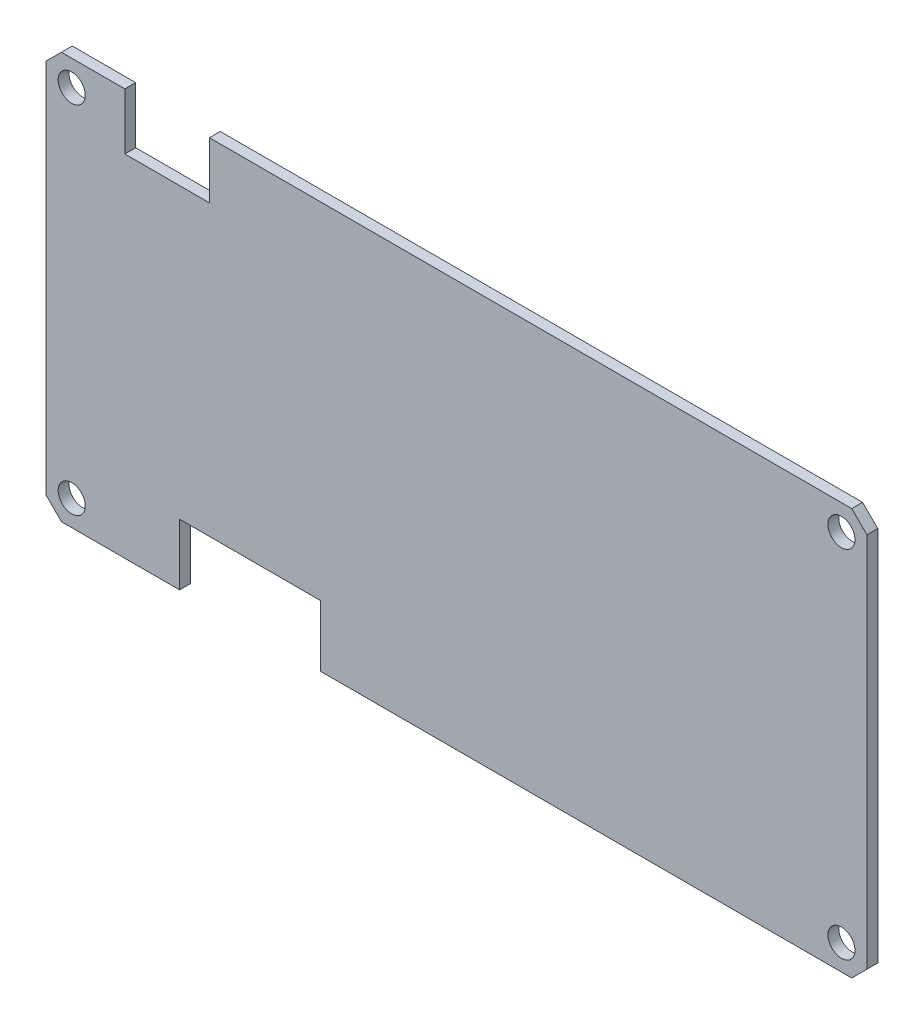
ISO-10303-21;
HEADER;
FILE_DESCRIPTION(('STEP AP214'),'2;1');
FILE_NAME('part.step','',(''),(''),'','','');
FILE_SCHEMA(('AUTOMOTIVE_DESIGN { 1 0 10303 214 1 1 1 1 }'));
ENDSEC;
DATA;
#1=APPLICATION_CONTEXT('core data for automotive mechanical design processes');
#2=APPLICATION_PROTOCOL_DEFINITION('international standard','automotive_design',2000,#1);
#3=PRODUCT_CONTEXT('',#1,'mechanical');
#4=PRODUCT('Part','Part','',(#3));
#5=PRODUCT_RELATED_PRODUCT_CATEGORY('part','',(#4));
#6=PRODUCT_DEFINITION_FORMATION('','',#4);
#7=PRODUCT_DEFINITION_CONTEXT('part definition',#1,'design');
#8=PRODUCT_DEFINITION('design','',#6,#7);
#9=PRODUCT_DEFINITION_SHAPE('','',#8);
#10=(LENGTH_UNIT() NAMED_UNIT(*) SI_UNIT(.MILLI.,.METRE.));
#11=(NAMED_UNIT(*) PLANE_ANGLE_UNIT() SI_UNIT($,.RADIAN.));
#12=(NAMED_UNIT(*) SI_UNIT($,.STERADIAN.) SOLID_ANGLE_UNIT());
#13=UNCERTAINTY_MEASURE_WITH_UNIT(LENGTH_MEASURE(1.E-05),#10,'distance_accuracy_value','');
#14=(GEOMETRIC_REPRESENTATION_CONTEXT(3) GLOBAL_UNCERTAINTY_ASSIGNED_CONTEXT((#13)) GLOBAL_UNIT_ASSIGNED_CONTEXT((#10,
#11,#12)) REPRESENTATION_CONTEXT('',''));
#15=CARTESIAN_POINT('',(0.,0.,0.));
#16=DIRECTION('',(0.,0.,1.));
#17=DIRECTION('',(1.,0.,0.));
#18=AXIS2_PLACEMENT_3D('',#15,#16,#17);
#19=CARTESIAN_POINT('',(0.,18.75,1.));
#20=DIRECTION('',(0.,-1.,0.));
#21=DIRECTION('',(1.,0.,0.));
#22=AXIS2_PLACEMENT_3D('',#19,#20,#21);
#23=PLANE('',#22);
#24=DIRECTION('',(-1.,0.,0.));
#25=VECTOR('',#24,1.);
#26=CARTESIAN_POINT('',(0.,18.75,0.));
#27=LINE('',#26,#25);
#28=CARTESIAN_POINT('',(40.5,18.75,0.));
#29=VERTEX_POINT('',#28);
#30=CARTESIAN_POINT('',(-18.75,18.75,0.));
#31=VERTEX_POINT('',#30);
#32=EDGE_CURVE('E37',#29,#31,#27,.T.);
#33=ORIENTED_EDGE('',*,*,#32,.T.);
#34=DIRECTION('',(0.,0.,-1.));
#35=VECTOR('',#34,1.);
#36=CARTESIAN_POINT('',(-18.75,18.75,1.));
#37=LINE('',#36,#35);
#38=CARTESIAN_POINT('',(-18.75,18.75,1.));
#39=VERTEX_POINT('',#38);
#40=EDGE_CURVE('E176',#39,#31,#37,.T.);
#41=ORIENTED_EDGE('',*,*,#40,.F.);
#42=DIRECTION('',(-1.,0.,0.));
#43=VECTOR('',#42,1.);
#44=CARTESIAN_POINT('',(0.,18.75,1.));
#45=LINE('',#44,#43);
#46=CARTESIAN_POINT('',(40.5,18.75,1.));
#47=VERTEX_POINT('',#46);
#48=EDGE_CURVE('E11',#47,#39,#45,.T.);
#49=ORIENTED_EDGE('',*,*,#48,.F.);
#50=DIRECTION('',(0.,0.,-1.));
#51=VECTOR('',#50,1.);
#52=CARTESIAN_POINT('',(40.5,18.75,1.));
#53=LINE('',#52,#51);
#54=EDGE_CURVE('E243',#47,#29,#53,.T.);
#55=ORIENTED_EDGE('',*,*,#54,.T.);
#56=EDGE_LOOP('',(#33,#41,#49,#55));
#57=FACE_BOUND('',#56,.T.);
#58=ADVANCED_FACE('F33',(#57),#23,.F.);
#59=CARTESIAN_POINT('',(0.,-18.75,1.));
#60=DIRECTION('',(0.,1.,0.));
#61=DIRECTION('',(-1.,0.,0.));
#62=AXIS2_PLACEMENT_3D('',#59,#60,#61);
#63=PLANE('',#62);
#64=DIRECTION('',(1.,0.,0.));
#65=VECTOR('',#64,1.);
#66=CARTESIAN_POINT('',(0.,-18.75,0.));
#67=LINE('',#66,#65);
#68=CARTESIAN_POINT('',(-32.4,-18.75,0.));
#69=VERTEX_POINT('',#68);
#70=CARTESIAN_POINT('',(-21.5,-18.75,0.));
#71=VERTEX_POINT('',#70);
#72=EDGE_CURVE('E286',#69,#71,#67,.T.);
#73=ORIENTED_EDGE('',*,*,#72,.T.);
#74=DIRECTION('',(0.,0.,1.));
#75=VECTOR('',#74,1.);
#76=CARTESIAN_POINT('',(-21.5,-18.75,0.));
#77=LINE('',#76,#75);
#78=CARTESIAN_POINT('',(-21.5,-18.75,1.));
#79=VERTEX_POINT('',#78);
#80=EDGE_CURVE('E191',#71,#79,#77,.T.);
#81=ORIENTED_EDGE('',*,*,#80,.T.);
#82=DIRECTION('',(1.,0.,0.));
#83=VECTOR('',#82,1.);
#84=CARTESIAN_POINT('',(0.,-18.75,1.));
#85=LINE('',#84,#83);
#86=CARTESIAN_POINT('',(-32.4,-18.75,1.));
#87=VERTEX_POINT('',#86);
#88=EDGE_CURVE('E281',#87,#79,#85,.T.);
#89=ORIENTED_EDGE('',*,*,#88,.F.);
#90=DIRECTION('',(0.,0.,-1.));
#91=VECTOR('',#90,1.);
#92=CARTESIAN_POINT('',(-32.4,-18.75,1.));
#93=LINE('',#92,#91);
#94=EDGE_CURVE('E213',#87,#69,#93,.T.);
#95=ORIENTED_EDGE('',*,*,#94,.T.);
#96=EDGE_LOOP('',(#73,#81,#89,#95));
#97=FACE_BOUND('',#96,.T.);
#98=ADVANCED_FACE('F335',(#97),#63,.F.);
#99=CARTESIAN_POINT('',(-33.8,-18.75,1.));
#100=DIRECTION('',(1.,0.,0.));
#101=DIRECTION('',(0.,0.,-1.));
#102=AXIS2_PLACEMENT_3D('',#99,#100,#101);
#103=PLANE('',#102);
#104=DIRECTION('',(0.,-1.,0.));
#105=VECTOR('',#104,1.);
#106=CARTESIAN_POINT('',(-33.8,-18.75,0.));
#107=LINE('',#106,#105);
#108=CARTESIAN_POINT('',(-33.8,17.35,0.));
#109=VERTEX_POINT('',#108);
#110=CARTESIAN_POINT('',(-33.8,-17.35,0.));
#111=VERTEX_POINT('',#110);
#112=EDGE_CURVE('E276',#109,#111,#107,.T.);
#113=ORIENTED_EDGE('',*,*,#112,.T.);
#114=DIRECTION('',(0.,0.,-1.));
#115=VECTOR('',#114,1.);
#116=CARTESIAN_POINT('',(-33.8,-17.35,1.));
#117=LINE('',#116,#115);
#118=CARTESIAN_POINT('',(-33.8,-17.35,1.));
#119=VERTEX_POINT('',#118);
#120=EDGE_CURVE('E223',#119,#111,#117,.T.);
#121=ORIENTED_EDGE('',*,*,#120,.F.);
#122=DIRECTION('',(0.,-1.,0.));
#123=VECTOR('',#122,1.);
#124=CARTESIAN_POINT('',(-33.8,-18.75,1.));
#125=LINE('',#124,#123);
#126=CARTESIAN_POINT('',(-33.8,17.35,1.));
#127=VERTEX_POINT('',#126);
#128=EDGE_CURVE('E277',#127,#119,#125,.T.);
#129=ORIENTED_EDGE('',*,*,#128,.F.);
#130=DIRECTION('',(0.,0.,-1.));
#131=VECTOR('',#130,1.);
#132=CARTESIAN_POINT('',(-33.8,17.35,1.));
#133=LINE('',#132,#131);
#134=EDGE_CURVE('E233',#127,#109,#133,.T.);
#135=ORIENTED_EDGE('',*,*,#134,.T.);
#136=EDGE_LOOP('',(#113,#121,#129,#135));
#137=FACE_BOUND('',#136,.T.);
#138=ADVANCED_FACE('F35',(#137),#103,.F.);
#139=CARTESIAN_POINT('',(-8.50000000000001,-18.75,1.));
#140=VERTEX_POINT('',#139);
#141=CARTESIAN_POINT('',(40.5,-18.75,1.));
#142=VERTEX_POINT('',#141);
#143=EDGE_CURVE('E280',#140,#142,#85,.T.);
#144=ORIENTED_EDGE('',*,*,#143,.F.);
#145=DIRECTION('',(0.,0.,1.));
#146=VECTOR('',#145,1.);
#147=CARTESIAN_POINT('',(-8.50000000000001,-18.75,0.));
#148=LINE('',#147,#146);
#149=CARTESIAN_POINT('',(-8.50000000000001,-18.75,0.));
#150=VERTEX_POINT('',#149);
#151=EDGE_CURVE('E203',#150,#140,#148,.T.);
#152=ORIENTED_EDGE('',*,*,#151,.F.);
#153=CARTESIAN_POINT('',(40.5,-18.75,0.));
#154=VERTEX_POINT('',#153);
#155=EDGE_CURVE('E285',#150,#154,#67,.T.);
#156=ORIENTED_EDGE('',*,*,#155,.T.);
#157=DIRECTION('',(0.,0.,-1.));
#158=VECTOR('',#157,1.);
#159=CARTESIAN_POINT('',(40.5,-18.75,1.));
#160=LINE('',#159,#158);
#161=EDGE_CURVE('E214',#142,#154,#160,.T.);
#162=ORIENTED_EDGE('',*,*,#161,.F.);
#163=EDGE_LOOP('',(#144,#152,#156,#162));
#164=FACE_BOUND('',#163,.T.);
#165=ADVANCED_FACE('F296',(#164),#63,.F.);
#166=CARTESIAN_POINT('',(-26.55,18.75,1.));
#167=VERTEX_POINT('',#166);
#168=CARTESIAN_POINT('',(-32.4,18.75,1.));
#169=VERTEX_POINT('',#168);
#170=EDGE_CURVE('E42',#167,#169,#45,.T.);
#171=ORIENTED_EDGE('',*,*,#170,.F.);
#172=DIRECTION('',(0.,0.,-1.));
#173=VECTOR('',#172,1.);
#174=CARTESIAN_POINT('',(-26.55,18.75,1.));
#175=LINE('',#174,#173);
#176=CARTESIAN_POINT('',(-26.55,18.75,0.));
#177=VERTEX_POINT('',#176);
#178=EDGE_CURVE('E179',#167,#177,#175,.T.);
#179=ORIENTED_EDGE('',*,*,#178,.T.);
#180=CARTESIAN_POINT('',(-32.4,18.75,0.));
#181=VERTEX_POINT('',#180);
#182=EDGE_CURVE('E288',#177,#181,#27,.T.);
#183=ORIENTED_EDGE('',*,*,#182,.T.);
#184=DIRECTION('',(0.,0.,-1.));
#185=VECTOR('',#184,1.);
#186=CARTESIAN_POINT('',(-32.4,18.75,1.));
#187=LINE('',#186,#185);
#188=EDGE_CURVE('E226',#169,#181,#187,.T.);
#189=ORIENTED_EDGE('',*,*,#188,.F.);
#190=EDGE_LOOP('',(#171,#179,#183,#189));
#191=FACE_BOUND('',#190,.T.);
#192=ADVANCED_FACE('F322',(#191),#23,.F.);
#193=CARTESIAN_POINT('',(0.,0.,1.));
#194=DIRECTION('',(0.,0.,1.));
#195=DIRECTION('',(1.,0.,0.));
#196=AXIS2_PLACEMENT_3D('',#193,#194,#195);
#197=PLANE('',#196);
#198=DIRECTION('',(0.,-1.,0.));
#199=VECTOR('',#198,1.);
#200=CARTESIAN_POINT('',(-18.75,18.75,1.));
#201=LINE('',#200,#199);
#202=CARTESIAN_POINT('',(-18.75,13.55,1.));
#203=VERTEX_POINT('',#202);
#204=EDGE_CURVE('E149',#39,#203,#201,.T.);
#205=ORIENTED_EDGE('',*,*,#204,.T.);
#206=DIRECTION('',(-1.,0.,0.));
#207=VECTOR('',#206,1.);
#208=CARTESIAN_POINT('',(-18.75,13.55,1.));
#209=LINE('',#208,#207);
#210=CARTESIAN_POINT('',(-26.55,13.55,1.));
#211=VERTEX_POINT('',#210);
#212=EDGE_CURVE('E158',#203,#211,#209,.T.);
#213=ORIENTED_EDGE('',*,*,#212,.T.);
#214=DIRECTION('',(0.,1.,0.));
#215=VECTOR('',#214,1.);
#216=CARTESIAN_POINT('',(-26.55,18.75,1.));
#217=LINE('',#216,#215);
#218=EDGE_CURVE('E155',#211,#167,#217,.T.);
#219=ORIENTED_EDGE('',*,*,#218,.T.);
#220=ORIENTED_EDGE('',*,*,#170,.T.);
#221=DIRECTION('',(-0.707106781186549,-0.707106781186546,0.));
#222=VECTOR('',#221,1.);
#223=CARTESIAN_POINT('',(-32.4,18.75,1.));
#224=LINE('',#223,#222);
#225=EDGE_CURVE('E230',#169,#127,#224,.T.);
#226=ORIENTED_EDGE('',*,*,#225,.T.);
#227=ORIENTED_EDGE('',*,*,#128,.T.);
#228=DIRECTION('',(0.707106781186549,-0.707106781186546,0.));
#229=VECTOR('',#228,1.);
#230=CARTESIAN_POINT('',(-32.4,-18.75,1.));
#231=LINE('',#230,#229);
#232=EDGE_CURVE('E220',#119,#87,#231,.T.);
#233=ORIENTED_EDGE('',*,*,#232,.T.);
#234=ORIENTED_EDGE('',*,*,#88,.T.);
#235=DIRECTION('',(0.,-1.,0.));
#236=VECTOR('',#235,1.);
#237=CARTESIAN_POINT('',(-21.5,-18.75,1.));
#238=LINE('',#237,#236);
#239=CARTESIAN_POINT('',(-21.5,-13.1,1.));
#240=VERTEX_POINT('',#239);
#241=EDGE_CURVE('E178',#240,#79,#238,.T.);
#242=ORIENTED_EDGE('',*,*,#241,.F.);
#243=DIRECTION('',(-1.,0.,0.));
#244=VECTOR('',#243,1.);
#245=CARTESIAN_POINT('',(-21.5,-13.1,1.));
#246=LINE('',#245,#244);
#247=CARTESIAN_POINT('',(-8.50000000000001,-13.1,1.));
#248=VERTEX_POINT('',#247);
#249=EDGE_CURVE('E187',#248,#240,#246,.T.);
#250=ORIENTED_EDGE('',*,*,#249,.F.);
#251=DIRECTION('',(0.,1.,0.));
#252=VECTOR('',#251,1.);
#253=CARTESIAN_POINT('',(-8.50000000000001,-18.75,1.));
#254=LINE('',#253,#252);
#255=EDGE_CURVE('E193',#140,#248,#254,.T.);
#256=ORIENTED_EDGE('',*,*,#255,.F.);
#257=ORIENTED_EDGE('',*,*,#143,.T.);
#258=DIRECTION('',(0.707106781186549,0.707106781186546,0.));
#259=VECTOR('',#258,1.);
#260=CARTESIAN_POINT('',(40.5,-18.75,1.));
#261=LINE('',#260,#259);
#262=CARTESIAN_POINT('',(41.9,-17.35,1.));
#263=VERTEX_POINT('',#262);
#264=EDGE_CURVE('E207',#142,#263,#261,.T.);
#265=ORIENTED_EDGE('',*,*,#264,.T.);
#266=DIRECTION('',(0.,1.,0.));
#267=VECTOR('',#266,1.);
#268=CARTESIAN_POINT('',(41.9,18.75,1.));
#269=LINE('',#268,#267);
#270=CARTESIAN_POINT('',(41.9,17.35,1.));
#271=VERTEX_POINT('',#270);
#272=EDGE_CURVE('E274',#263,#271,#269,.T.);
#273=ORIENTED_EDGE('',*,*,#272,.T.);
#274=DIRECTION('',(-0.707106781186549,0.707106781186546,0.));
#275=VECTOR('',#274,1.);
#276=CARTESIAN_POINT('',(40.5,18.75,1.));
#277=LINE('',#276,#275);
#278=EDGE_CURVE('E239',#271,#47,#277,.T.);
#279=ORIENTED_EDGE('',*,*,#278,.T.);
#280=ORIENTED_EDGE('',*,*,#48,.T.);
#281=EDGE_LOOP('',(#205,#213,#219,#220,#226,#227,#233,#234,#242,#250,#256,#257,#265,#273,#279,#280));
#282=FACE_BOUND('',#281,.T.);
#283=CARTESIAN_POINT('',(39.55,-16.4,1.));
#284=DIRECTION('',(0.,0.,-1.));
#285=DIRECTION('',(-1.,0.,0.));
#286=AXIS2_PLACEMENT_3D('',#283,#284,#285);
#287=CIRCLE('',#286,1.25);
#288=CARTESIAN_POINT('',(38.3,-16.4,1.));
#289=VERTEX_POINT('',#288);
#290=EDGE_CURVE('E249',#289,#289,#287,.T.);
#291=ORIENTED_EDGE('',*,*,#290,.T.);
#292=EDGE_LOOP('',(#291));
#293=FACE_BOUND('',#292,.T.);
#294=CARTESIAN_POINT('',(39.55,16.4,1.));
#295=DIRECTION('',(0.,0.,-1.));
#296=DIRECTION('',(-1.,0.,0.));
#297=AXIS2_PLACEMENT_3D('',#294,#295,#296);
#298=CIRCLE('',#297,1.25);
#299=CARTESIAN_POINT('',(38.3,16.4,1.));
#300=VERTEX_POINT('',#299);
#301=EDGE_CURVE('E256',#300,#300,#298,.T.);
#302=ORIENTED_EDGE('',*,*,#301,.T.);
#303=EDGE_LOOP('',(#302));
#304=FACE_BOUND('',#303,.T.);
#305=CARTESIAN_POINT('',(-31.45,16.4,1.));
#306=DIRECTION('',(0.,0.,-1.));
#307=DIRECTION('',(-1.,0.,0.));
#308=AXIS2_PLACEMENT_3D('',#305,#306,#307);
#309=CIRCLE('',#308,1.25);
#310=CARTESIAN_POINT('',(-32.7,16.4,1.));
#311=VERTEX_POINT('',#310);
#312=EDGE_CURVE('E262',#311,#311,#309,.T.);
#313=ORIENTED_EDGE('',*,*,#312,.T.);
#314=EDGE_LOOP('',(#313));
#315=FACE_BOUND('',#314,.T.);
#316=CARTESIAN_POINT('',(-31.45,-16.4,1.));
#317=DIRECTION('',(0.,0.,-1.));
#318=DIRECTION('',(-1.,0.,0.));
#319=AXIS2_PLACEMENT_3D('',#316,#317,#318);
#320=CIRCLE('',#319,1.25);
#321=CARTESIAN_POINT('',(-32.7,-16.4,1.));
#322=VERTEX_POINT('',#321);
#323=EDGE_CURVE('E267',#322,#322,#320,.T.);
#324=ORIENTED_EDGE('',*,*,#323,.T.);
#325=EDGE_LOOP('',(#324));
#326=FACE_BOUND('',#325,.T.);
#327=ADVANCED_FACE('F164',(#282,#293,#304,#315,#326),#197,.T.);
#328=CARTESIAN_POINT('',(0.,0.,0.));
#329=DIRECTION('',(0.,0.,1.));
#330=DIRECTION('',(1.,0.,0.));
#331=AXIS2_PLACEMENT_3D('',#328,#329,#330);
#332=PLANE('',#331);
#333=CARTESIAN_POINT('',(39.55,-16.4,0.));
#334=DIRECTION('',(0.,0.,-1.));
#335=DIRECTION('',(-1.,0.,0.));
#336=AXIS2_PLACEMENT_3D('',#333,#334,#335);
#337=CIRCLE('',#336,1.25);
#338=CARTESIAN_POINT('',(38.3,-16.4,0.));
#339=VERTEX_POINT('',#338);
#340=EDGE_CURVE('E253',#339,#339,#337,.T.);
#341=ORIENTED_EDGE('',*,*,#340,.F.);
#342=EDGE_LOOP('',(#341));
#343=FACE_BOUND('',#342,.T.);
#344=CARTESIAN_POINT('',(39.55,16.4,0.));
#345=DIRECTION('',(0.,0.,-1.));
#346=DIRECTION('',(-1.,0.,0.));
#347=AXIS2_PLACEMENT_3D('',#344,#345,#346);
#348=CIRCLE('',#347,1.25);
#349=CARTESIAN_POINT('',(38.3,16.4,0.));
#350=VERTEX_POINT('',#349);
#351=EDGE_CURVE('E259',#350,#350,#348,.T.);
#352=ORIENTED_EDGE('',*,*,#351,.F.);
#353=EDGE_LOOP('',(#352));
#354=FACE_BOUND('',#353,.T.);
#355=CARTESIAN_POINT('',(-31.45,16.4,0.));
#356=DIRECTION('',(0.,0.,-1.));
#357=DIRECTION('',(-1.,0.,0.));
#358=AXIS2_PLACEMENT_3D('',#355,#356,#357);
#359=CIRCLE('',#358,1.25);
#360=CARTESIAN_POINT('',(-32.7,16.4,0.));
#361=VERTEX_POINT('',#360);
#362=EDGE_CURVE('E246',#361,#361,#359,.T.);
#363=ORIENTED_EDGE('',*,*,#362,.F.);
#364=EDGE_LOOP('',(#363));
#365=FACE_BOUND('',#364,.T.);
#366=CARTESIAN_POINT('',(-31.45,-16.4,0.));
#367=DIRECTION('',(0.,0.,-1.));
#368=DIRECTION('',(-1.,0.,0.));
#369=AXIS2_PLACEMENT_3D('',#366,#367,#368);
#370=CIRCLE('',#369,1.25);
#371=CARTESIAN_POINT('',(-32.7,-16.4,0.));
#372=VERTEX_POINT('',#371);
#373=EDGE_CURVE('E252',#372,#372,#370,.T.);
#374=ORIENTED_EDGE('',*,*,#373,.F.);
#375=EDGE_LOOP('',(#374));
#376=FACE_BOUND('',#375,.T.);
#377=DIRECTION('',(-1.,0.,0.));
#378=VECTOR('',#377,1.);
#379=CARTESIAN_POINT('',(-18.75,13.55,0.));
#380=LINE('',#379,#378);
#381=CARTESIAN_POINT('',(-18.75,13.55,0.));
#382=VERTEX_POINT('',#381);
#383=CARTESIAN_POINT('',(-26.55,13.55,0.));
#384=VERTEX_POINT('',#383);
#385=EDGE_CURVE('E170',#382,#384,#380,.T.);
#386=ORIENTED_EDGE('',*,*,#385,.F.);
#387=DIRECTION('',(0.,-1.,0.));
#388=VECTOR('',#387,1.);
#389=CARTESIAN_POINT('',(-18.75,18.75,0.));
#390=LINE('',#389,#388);
#391=EDGE_CURVE('E50',#31,#382,#390,.T.);
#392=ORIENTED_EDGE('',*,*,#391,.F.);
#393=ORIENTED_EDGE('',*,*,#32,.F.);
#394=DIRECTION('',(-0.707106781186549,0.707106781186546,0.));
#395=VECTOR('',#394,1.);
#396=CARTESIAN_POINT('',(40.5,18.75,0.));
#397=LINE('',#396,#395);
#398=CARTESIAN_POINT('',(41.9,17.35,0.));
#399=VERTEX_POINT('',#398);
#400=EDGE_CURVE('E217',#399,#29,#397,.T.);
#401=ORIENTED_EDGE('',*,*,#400,.F.);
#402=DIRECTION('',(0.,1.,0.));
#403=VECTOR('',#402,1.);
#404=CARTESIAN_POINT('',(41.9,18.75,0.));
#405=LINE('',#404,#403);
#406=CARTESIAN_POINT('',(41.9,-17.35,0.));
#407=VERTEX_POINT('',#406);
#408=EDGE_CURVE('E270',#407,#399,#405,.T.);
#409=ORIENTED_EDGE('',*,*,#408,.F.);
#410=DIRECTION('',(0.707106781186549,0.707106781186546,0.));
#411=VECTOR('',#410,1.);
#412=CARTESIAN_POINT('',(40.5,-18.75,0.));
#413=LINE('',#412,#411);
#414=EDGE_CURVE('E211',#154,#407,#413,.T.);
#415=ORIENTED_EDGE('',*,*,#414,.F.);
#416=ORIENTED_EDGE('',*,*,#155,.F.);
#417=DIRECTION('',(0.,1.,0.));
#418=VECTOR('',#417,1.);
#419=CARTESIAN_POINT('',(-8.50000000000001,-18.75,0.));
#420=LINE('',#419,#418);
#421=CARTESIAN_POINT('',(-8.50000000000001,-13.1,0.));
#422=VERTEX_POINT('',#421);
#423=EDGE_CURVE('E186',#150,#422,#420,.T.);
#424=ORIENTED_EDGE('',*,*,#423,.T.);
#425=DIRECTION('',(-1.,0.,0.));
#426=VECTOR('',#425,1.);
#427=CARTESIAN_POINT('',(-21.5,-13.1,0.));
#428=LINE('',#427,#426);
#429=CARTESIAN_POINT('',(-21.5,-13.1,0.));
#430=VERTEX_POINT('',#429);
#431=EDGE_CURVE('E58',#422,#430,#428,.T.);
#432=ORIENTED_EDGE('',*,*,#431,.T.);
#433=DIRECTION('',(0.,-1.,0.));
#434=VECTOR('',#433,1.);
#435=CARTESIAN_POINT('',(-21.5,-18.75,0.));
#436=LINE('',#435,#434);
#437=EDGE_CURVE('E183',#430,#71,#436,.T.);
#438=ORIENTED_EDGE('',*,*,#437,.T.);
#439=ORIENTED_EDGE('',*,*,#72,.F.);
#440=DIRECTION('',(0.707106781186549,-0.707106781186546,0.));
#441=VECTOR('',#440,1.);
#442=CARTESIAN_POINT('',(-32.4,-18.75,0.));
#443=LINE('',#442,#441);
#444=EDGE_CURVE('E224',#111,#69,#443,.T.);
#445=ORIENTED_EDGE('',*,*,#444,.F.);
#446=ORIENTED_EDGE('',*,*,#112,.F.);
#447=DIRECTION('',(-0.707106781186549,-0.707106781186546,0.));
#448=VECTOR('',#447,1.);
#449=CARTESIAN_POINT('',(-32.4,18.75,0.));
#450=LINE('',#449,#448);
#451=EDGE_CURVE('E200',#181,#109,#450,.T.);
#452=ORIENTED_EDGE('',*,*,#451,.F.);
#453=ORIENTED_EDGE('',*,*,#182,.F.);
#454=DIRECTION('',(0.,1.,0.));
#455=VECTOR('',#454,1.);
#456=CARTESIAN_POINT('',(-26.55,18.75,0.));
#457=LINE('',#456,#455);
#458=EDGE_CURVE('E168',#384,#177,#457,.T.);
#459=ORIENTED_EDGE('',*,*,#458,.F.);
#460=EDGE_LOOP('',(#386,#392,#393,#401,#409,#415,#416,#424,#432,#438,#439,#445,#446,#452,#453,#459));
#461=FACE_BOUND('',#460,.T.);
#462=ADVANCED_FACE('F303',(#343,#354,#365,#376,#461),#332,.F.);
#463=CARTESIAN_POINT('',(41.9,18.75,57.2304188140192));
#464=DIRECTION('',(-1.,0.,0.));
#465=DIRECTION('',(0.,-1.,0.));
#466=AXIS2_PLACEMENT_3D('',#463,#464,#465);
#467=PLANE('',#466);
#468=ORIENTED_EDGE('',*,*,#272,.F.);
#469=DIRECTION('',(0.,0.,-1.));
#470=VECTOR('',#469,1.);
#471=CARTESIAN_POINT('',(41.9,-17.35,1.));
#472=LINE('',#471,#470);
#473=EDGE_CURVE('E210',#263,#407,#472,.T.);
#474=ORIENTED_EDGE('',*,*,#473,.T.);
#475=ORIENTED_EDGE('',*,*,#408,.T.);
#476=DIRECTION('',(0.,0.,-1.));
#477=VECTOR('',#476,1.);
#478=CARTESIAN_POINT('',(41.9,17.35,1.));
#479=LINE('',#478,#477);
#480=EDGE_CURVE('E241',#271,#399,#479,.T.);
#481=ORIENTED_EDGE('',*,*,#480,.F.);
#482=EDGE_LOOP('',(#468,#474,#475,#481));
#483=FACE_BOUND('',#482,.T.);
#484=ADVANCED_FACE('F309',(#483),#467,.F.);
#485=CARTESIAN_POINT('',(-31.45,-16.4,1.));
#486=DIRECTION('',(0.,0.,-1.));
#487=DIRECTION('',(-1.,0.,0.));
#488=AXIS2_PLACEMENT_3D('',#485,#486,#487);
#489=CYLINDRICAL_SURFACE('',#488,1.25);
#490=ORIENTED_EDGE('',*,*,#323,.F.);
#491=EDGE_LOOP('',(#490));
#492=FACE_BOUND('',#491,.T.);
#493=ORIENTED_EDGE('',*,*,#373,.T.);
#494=EDGE_LOOP('',(#493));
#495=FACE_BOUND('',#494,.T.);
#496=ADVANCED_FACE('F461',(#492,#495),#489,.F.);
#497=CARTESIAN_POINT('',(-31.45,16.4,1.));
#498=DIRECTION('',(0.,0.,-1.));
#499=DIRECTION('',(-1.,0.,0.));
#500=AXIS2_PLACEMENT_3D('',#497,#498,#499);
#501=CYLINDRICAL_SURFACE('',#500,1.25);
#502=ORIENTED_EDGE('',*,*,#312,.F.);
#503=EDGE_LOOP('',(#502));
#504=FACE_BOUND('',#503,.T.);
#505=ORIENTED_EDGE('',*,*,#362,.T.);
#506=EDGE_LOOP('',(#505));
#507=FACE_BOUND('',#506,.T.);
#508=ADVANCED_FACE('F468',(#504,#507),#501,.F.);
#509=CARTESIAN_POINT('',(39.55,16.4,1.));
#510=DIRECTION('',(0.,0.,-1.));
#511=DIRECTION('',(-1.,0.,0.));
#512=AXIS2_PLACEMENT_3D('',#509,#510,#511);
#513=CYLINDRICAL_SURFACE('',#512,1.25);
#514=ORIENTED_EDGE('',*,*,#301,.F.);
#515=EDGE_LOOP('',(#514));
#516=FACE_BOUND('',#515,.T.);
#517=ORIENTED_EDGE('',*,*,#351,.T.);
#518=EDGE_LOOP('',(#517));
#519=FACE_BOUND('',#518,.T.);
#520=ADVANCED_FACE('F476',(#516,#519),#513,.F.);
#521=CARTESIAN_POINT('',(39.55,-16.4,1.));
#522=DIRECTION('',(0.,0.,-1.));
#523=DIRECTION('',(-1.,0.,0.));
#524=AXIS2_PLACEMENT_3D('',#521,#522,#523);
#525=CYLINDRICAL_SURFACE('',#524,1.25);
#526=ORIENTED_EDGE('',*,*,#290,.F.);
#527=EDGE_LOOP('',(#526));
#528=FACE_BOUND('',#527,.T.);
#529=ORIENTED_EDGE('',*,*,#340,.T.);
#530=EDGE_LOOP('',(#529));
#531=FACE_BOUND('',#530,.T.);
#532=ADVANCED_FACE('F484',(#528,#531),#525,.F.);
#533=CARTESIAN_POINT('',(40.5,18.75,1.));
#534=DIRECTION('',(-0.707106781186546,-0.707106781186549,0.));
#535=DIRECTION('',(0.707106781186549,-0.707106781186546,0.));
#536=AXIS2_PLACEMENT_3D('',#533,#534,#535);
#537=PLANE('',#536);
#538=ORIENTED_EDGE('',*,*,#400,.T.);
#539=ORIENTED_EDGE('',*,*,#54,.F.);
#540=ORIENTED_EDGE('',*,*,#278,.F.);
#541=ORIENTED_EDGE('',*,*,#480,.T.);
#542=EDGE_LOOP('',(#538,#539,#540,#541));
#543=FACE_BOUND('',#542,.T.);
#544=ADVANCED_FACE('F312',(#543),#537,.F.);
#545=CARTESIAN_POINT('',(40.5,-18.75,1.));
#546=DIRECTION('',(-0.707106781186546,0.707106781186549,0.));
#547=DIRECTION('',(-0.707106781186549,-0.707106781186546,0.));
#548=AXIS2_PLACEMENT_3D('',#545,#546,#547);
#549=PLANE('',#548);
#550=ORIENTED_EDGE('',*,*,#414,.T.);
#551=ORIENTED_EDGE('',*,*,#473,.F.);
#552=ORIENTED_EDGE('',*,*,#264,.F.);
#553=ORIENTED_EDGE('',*,*,#161,.T.);
#554=EDGE_LOOP('',(#550,#551,#552,#553));
#555=FACE_BOUND('',#554,.T.);
#556=ADVANCED_FACE('F301',(#555),#549,.F.);
#557=CARTESIAN_POINT('',(-32.4,18.75,1.));
#558=DIRECTION('',(0.707106781186546,-0.707106781186549,0.));
#559=DIRECTION('',(0.707106781186549,0.707106781186546,0.));
#560=AXIS2_PLACEMENT_3D('',#557,#558,#559);
#561=PLANE('',#560);
#562=ORIENTED_EDGE('',*,*,#451,.T.);
#563=ORIENTED_EDGE('',*,*,#134,.F.);
#564=ORIENTED_EDGE('',*,*,#225,.F.);
#565=ORIENTED_EDGE('',*,*,#188,.T.);
#566=EDGE_LOOP('',(#562,#563,#564,#565));
#567=FACE_BOUND('',#566,.T.);
#568=ADVANCED_FACE('F327',(#567),#561,.F.);
#569=CARTESIAN_POINT('',(-32.4,-18.75,1.));
#570=DIRECTION('',(0.707106781186546,0.707106781186549,0.));
#571=DIRECTION('',(-0.707106781186549,0.707106781186546,0.));
#572=AXIS2_PLACEMENT_3D('',#569,#570,#571);
#573=PLANE('',#572);
#574=ORIENTED_EDGE('',*,*,#444,.T.);
#575=ORIENTED_EDGE('',*,*,#94,.F.);
#576=ORIENTED_EDGE('',*,*,#232,.F.);
#577=ORIENTED_EDGE('',*,*,#120,.T.);
#578=EDGE_LOOP('',(#574,#575,#576,#577));
#579=FACE_BOUND('',#578,.T.);
#580=ADVANCED_FACE('F333',(#579),#573,.F.);
#581=CARTESIAN_POINT('',(-21.5,-18.75,0.));
#582=DIRECTION('',(-1.,0.,0.));
#583=DIRECTION('',(0.,0.,1.));
#584=AXIS2_PLACEMENT_3D('',#581,#582,#583);
#585=PLANE('',#584);
#586=ORIENTED_EDGE('',*,*,#241,.T.);
#587=ORIENTED_EDGE('',*,*,#80,.F.);
#588=ORIENTED_EDGE('',*,*,#437,.F.);
#589=DIRECTION('',(0.,0.,1.));
#590=VECTOR('',#589,1.);
#591=CARTESIAN_POINT('',(-21.5,-13.1,0.));
#592=LINE('',#591,#590);
#593=EDGE_CURVE('E198',#430,#240,#592,.T.);
#594=ORIENTED_EDGE('',*,*,#593,.T.);
#595=EDGE_LOOP('',(#586,#587,#588,#594));
#596=FACE_BOUND('',#595,.T.);
#597=ADVANCED_FACE('F340',(#596),#585,.F.);
#598=CARTESIAN_POINT('',(-21.5,-13.1,0.));
#599=DIRECTION('',(0.,1.,0.));
#600=DIRECTION('',(0.,0.,1.));
#601=AXIS2_PLACEMENT_3D('',#598,#599,#600);
#602=PLANE('',#601);
#603=ORIENTED_EDGE('',*,*,#249,.T.);
#604=ORIENTED_EDGE('',*,*,#593,.F.);
#605=ORIENTED_EDGE('',*,*,#431,.F.);
#606=DIRECTION('',(0.,0.,1.));
#607=VECTOR('',#606,1.);
#608=CARTESIAN_POINT('',(-8.50000000000001,-13.1,0.));
#609=LINE('',#608,#607);
#610=EDGE_CURVE('E201',#422,#248,#609,.T.);
#611=ORIENTED_EDGE('',*,*,#610,.T.);
#612=EDGE_LOOP('',(#603,#604,#605,#611));
#613=FACE_BOUND('',#612,.T.);
#614=ADVANCED_FACE('F342',(#613),#602,.F.);
#615=CARTESIAN_POINT('',(-8.50000000000001,-18.75,0.));
#616=DIRECTION('',(1.,0.,0.));
#617=DIRECTION('',(0.,0.,-1.));
#618=AXIS2_PLACEMENT_3D('',#615,#616,#617);
#619=PLANE('',#618);
#620=ORIENTED_EDGE('',*,*,#255,.T.);
#621=ORIENTED_EDGE('',*,*,#610,.F.);
#622=ORIENTED_EDGE('',*,*,#423,.F.);
#623=ORIENTED_EDGE('',*,*,#151,.T.);
#624=EDGE_LOOP('',(#620,#621,#622,#623));
#625=FACE_BOUND('',#624,.T.);
#626=ADVANCED_FACE('F344',(#625),#619,.F.);
#627=CARTESIAN_POINT('',(-18.75,18.75,1.));
#628=DIRECTION('',(1.,0.,0.));
#629=DIRECTION('',(0.,0.,-1.));
#630=AXIS2_PLACEMENT_3D('',#627,#628,#629);
#631=PLANE('',#630);
#632=ORIENTED_EDGE('',*,*,#391,.T.);
#633=DIRECTION('',(0.,0.,-1.));
#634=VECTOR('',#633,1.);
#635=CARTESIAN_POINT('',(-18.75,13.55,1.));
#636=LINE('',#635,#634);
#637=EDGE_CURVE('E145',#203,#382,#636,.T.);
#638=ORIENTED_EDGE('',*,*,#637,.F.);
#639=ORIENTED_EDGE('',*,*,#204,.F.);
#640=ORIENTED_EDGE('',*,*,#40,.T.);
#641=EDGE_LOOP('',(#632,#638,#639,#640));
#642=FACE_BOUND('',#641,.T.);
#643=ADVANCED_FACE('F147',(#642),#631,.F.);
#644=CARTESIAN_POINT('',(-26.55,18.75,1.));
#645=DIRECTION('',(-1.,0.,0.));
#646=DIRECTION('',(0.,0.,1.));
#647=AXIS2_PLACEMENT_3D('',#644,#645,#646);
#648=PLANE('',#647);
#649=ORIENTED_EDGE('',*,*,#458,.T.);
#650=ORIENTED_EDGE('',*,*,#178,.F.);
#651=ORIENTED_EDGE('',*,*,#218,.F.);
#652=DIRECTION('',(0.,0.,-1.));
#653=VECTOR('',#652,1.);
#654=CARTESIAN_POINT('',(-26.55,13.55,1.));
#655=LINE('',#654,#653);
#656=EDGE_CURVE('E154',#211,#384,#655,.T.);
#657=ORIENTED_EDGE('',*,*,#656,.T.);
#658=EDGE_LOOP('',(#649,#650,#651,#657));
#659=FACE_BOUND('',#658,.T.);
#660=ADVANCED_FACE('F319',(#659),#648,.F.);
#661=CARTESIAN_POINT('',(-18.75,13.55,1.));
#662=DIRECTION('',(0.,-1.,0.));
#663=DIRECTION('',(0.,0.,-1.));
#664=AXIS2_PLACEMENT_3D('',#661,#662,#663);
#665=PLANE('',#664);
#666=ORIENTED_EDGE('',*,*,#385,.T.);
#667=ORIENTED_EDGE('',*,*,#656,.F.);
#668=ORIENTED_EDGE('',*,*,#212,.F.);
#669=ORIENTED_EDGE('',*,*,#637,.T.);
#670=EDGE_LOOP('',(#666,#667,#668,#669));
#671=FACE_BOUND('',#670,.T.);
#672=ADVANCED_FACE('F159',(#671),#665,.F.);
#673=CLOSED_SHELL('',(#58,#98,#138,#165,#192,#327,#462,#484,#496,#508,#520,#532,#544,#556,#568,
#580,#597,#614,#626,#643,#660,#672));
#674=MANIFOLD_SOLID_BREP('B2',#673);
#675=ADVANCED_BREP_SHAPE_REPRESENTATION('',(#18,#674),#14);
#676=SHAPE_DEFINITION_REPRESENTATION(#9,#675);
ENDSEC;
END-ISO-10303-21;
